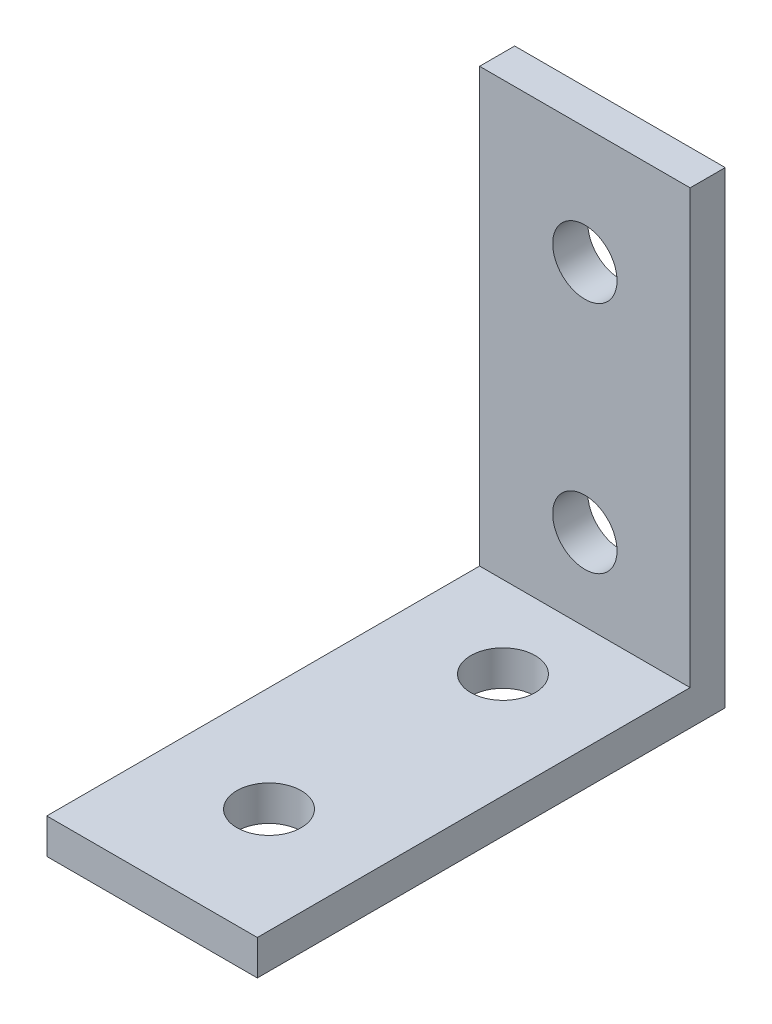
ISO-10303-21;
HEADER;
FILE_DESCRIPTION(('STEP AP214'),'2;1');
FILE_NAME('part.step','',(''),(''),'','','');
FILE_SCHEMA(('AUTOMOTIVE_DESIGN { 1 0 10303 214 1 1 1 1 }'));
ENDSEC;
DATA;
#1=APPLICATION_CONTEXT('core data for automotive mechanical design processes');
#2=APPLICATION_PROTOCOL_DEFINITION('international standard','automotive_design',2000,#1);
#3=PRODUCT_CONTEXT('',#1,'mechanical');
#4=PRODUCT('Part','Part','',(#3));
#5=PRODUCT_RELATED_PRODUCT_CATEGORY('part','',(#4));
#6=PRODUCT_DEFINITION_FORMATION('','',#4);
#7=PRODUCT_DEFINITION_CONTEXT('part definition',#1,'design');
#8=PRODUCT_DEFINITION('design','',#6,#7);
#9=PRODUCT_DEFINITION_SHAPE('','',#8);
#10=(LENGTH_UNIT() NAMED_UNIT(*) SI_UNIT(.MILLI.,.METRE.));
#11=(NAMED_UNIT(*) PLANE_ANGLE_UNIT() SI_UNIT($,.RADIAN.));
#12=(NAMED_UNIT(*) SI_UNIT($,.STERADIAN.) SOLID_ANGLE_UNIT());
#13=UNCERTAINTY_MEASURE_WITH_UNIT(LENGTH_MEASURE(1.E-05),#10,'distance_accuracy_value','');
#14=(GEOMETRIC_REPRESENTATION_CONTEXT(3) GLOBAL_UNCERTAINTY_ASSIGNED_CONTEXT((#13)) GLOBAL_UNIT_ASSIGNED_CONTEXT((#10,
#11,#12)) REPRESENTATION_CONTEXT('',''));
#15=CARTESIAN_POINT('',(0.,0.,0.));
#16=DIRECTION('',(0.,0.,1.));
#17=DIRECTION('',(1.,0.,0.));
#18=AXIS2_PLACEMENT_3D('',#15,#16,#17);
#19=CARTESIAN_POINT('',(0.,3.,0.));
#20=DIRECTION('',(0.,1.,0.));
#21=DIRECTION('',(0.,0.,1.));
#22=AXIS2_PLACEMENT_3D('',#19,#20,#21);
#23=PLANE('',#22);
#24=DIRECTION('',(1.,0.,0.));
#25=VECTOR('',#24,1.);
#26=CARTESIAN_POINT('',(-9.,3.,-17.));
#27=LINE('',#26,#25);
#28=CARTESIAN_POINT('',(-9.,3.,-17.));
#29=VERTEX_POINT('',#28);
#30=CARTESIAN_POINT('',(9.,3.,-17.));
#31=VERTEX_POINT('',#30);
#32=EDGE_CURVE('E51',#29,#31,#27,.T.);
#33=ORIENTED_EDGE('',*,*,#32,.F.);
#34=DIRECTION('',(0.,0.,1.));
#35=VECTOR('',#34,1.);
#36=CARTESIAN_POINT('',(-9.,3.,-20.));
#37=LINE('',#36,#35);
#38=CARTESIAN_POINT('',(-9.,3.,20.));
#39=VERTEX_POINT('',#38);
#40=EDGE_CURVE('E150',#29,#39,#37,.T.);
#41=ORIENTED_EDGE('',*,*,#40,.T.);
#42=DIRECTION('',(1.,0.,0.));
#43=VECTOR('',#42,1.);
#44=CARTESIAN_POINT('',(-9.,3.,20.));
#45=LINE('',#44,#43);
#46=CARTESIAN_POINT('',(9.,3.,20.));
#47=VERTEX_POINT('',#46);
#48=EDGE_CURVE('E57',#39,#47,#45,.T.);
#49=ORIENTED_EDGE('',*,*,#48,.T.);
#50=DIRECTION('',(0.,0.,-1.));
#51=VECTOR('',#50,1.);
#52=CARTESIAN_POINT('',(9.,3.,-20.));
#53=LINE('',#52,#51);
#54=EDGE_CURVE('E86',#47,#31,#53,.T.);
#55=ORIENTED_EDGE('',*,*,#54,.T.);
#56=EDGE_LOOP('',(#33,#41,#49,#55));
#57=FACE_BOUND('',#56,.T.);
#58=CARTESIAN_POINT('',(0.,3.,10.));
#59=DIRECTION('',(0.,1.,0.));
#60=DIRECTION('',(0.,0.,1.));
#61=AXIS2_PLACEMENT_3D('',#58,#59,#60);
#62=CIRCLE('',#61,2.75);
#63=CARTESIAN_POINT('',(0.,3.,12.75));
#64=VERTEX_POINT('',#63);
#65=EDGE_CURVE('E98',#64,#64,#62,.T.);
#66=ORIENTED_EDGE('',*,*,#65,.F.);
#67=EDGE_LOOP('',(#66));
#68=FACE_BOUND('',#67,.T.);
#69=CARTESIAN_POINT('',(0.,3.,-10.));
#70=DIRECTION('',(0.,1.,0.));
#71=DIRECTION('',(0.,0.,1.));
#72=AXIS2_PLACEMENT_3D('',#69,#70,#71);
#73=CIRCLE('',#72,2.75);
#74=CARTESIAN_POINT('',(0.,3.,-7.25));
#75=VERTEX_POINT('',#74);
#76=EDGE_CURVE('E143',#75,#75,#73,.T.);
#77=ORIENTED_EDGE('',*,*,#76,.F.);
#78=EDGE_LOOP('',(#77));
#79=FACE_BOUND('',#78,.T.);
#80=ADVANCED_FACE('F36',(#57,#68,#79),#23,.T.);
#81=CARTESIAN_POINT('',(0.,0.,0.));
#82=DIRECTION('',(0.,1.,0.));
#83=DIRECTION('',(0.,0.,1.));
#84=AXIS2_PLACEMENT_3D('',#81,#82,#83);
#85=PLANE('',#84);
#86=DIRECTION('',(0.,0.,-1.));
#87=VECTOR('',#86,1.);
#88=CARTESIAN_POINT('',(9.,0.,-20.));
#89=LINE('',#88,#87);
#90=CARTESIAN_POINT('',(9.,0.,20.));
#91=VERTEX_POINT('',#90);
#92=CARTESIAN_POINT('',(9.,0.,-20.));
#93=VERTEX_POINT('',#92);
#94=EDGE_CURVE('E92',#91,#93,#89,.T.);
#95=ORIENTED_EDGE('',*,*,#94,.F.);
#96=DIRECTION('',(1.,0.,0.));
#97=VECTOR('',#96,1.);
#98=CARTESIAN_POINT('',(-9.,0.,20.));
#99=LINE('',#98,#97);
#100=CARTESIAN_POINT('',(-9.,0.,20.));
#101=VERTEX_POINT('',#100);
#102=EDGE_CURVE('E76',#101,#91,#99,.T.);
#103=ORIENTED_EDGE('',*,*,#102,.F.);
#104=DIRECTION('',(0.,0.,1.));
#105=VECTOR('',#104,1.);
#106=CARTESIAN_POINT('',(-9.,0.,-20.));
#107=LINE('',#106,#105);
#108=CARTESIAN_POINT('',(-9.,0.,-20.));
#109=VERTEX_POINT('',#108);
#110=EDGE_CURVE('E87',#109,#101,#107,.T.);
#111=ORIENTED_EDGE('',*,*,#110,.F.);
#112=DIRECTION('',(-1.,0.,0.));
#113=VECTOR('',#112,1.);
#114=CARTESIAN_POINT('',(-9.,0.,-20.));
#115=LINE('',#114,#113);
#116=EDGE_CURVE('E97',#93,#109,#115,.T.);
#117=ORIENTED_EDGE('',*,*,#116,.F.);
#118=EDGE_LOOP('',(#95,#103,#111,#117));
#119=FACE_BOUND('',#118,.T.);
#120=CARTESIAN_POINT('',(0.,0.,10.));
#121=DIRECTION('',(0.,1.,0.));
#122=DIRECTION('',(0.,0.,1.));
#123=AXIS2_PLACEMENT_3D('',#120,#121,#122);
#124=CIRCLE('',#123,2.75);
#125=CARTESIAN_POINT('',(0.,0.,12.75));
#126=VERTEX_POINT('',#125);
#127=EDGE_CURVE('E102',#126,#126,#124,.T.);
#128=ORIENTED_EDGE('',*,*,#127,.T.);
#129=EDGE_LOOP('',(#128));
#130=FACE_BOUND('',#129,.T.);
#131=CARTESIAN_POINT('',(0.,0.,-10.));
#132=DIRECTION('',(0.,1.,0.));
#133=DIRECTION('',(0.,0.,1.));
#134=AXIS2_PLACEMENT_3D('',#131,#132,#133);
#135=CIRCLE('',#134,2.75);
#136=CARTESIAN_POINT('',(0.,0.,-7.25));
#137=VERTEX_POINT('',#136);
#138=EDGE_CURVE('E142',#137,#137,#135,.T.);
#139=ORIENTED_EDGE('',*,*,#138,.T.);
#140=EDGE_LOOP('',(#139));
#141=FACE_BOUND('',#140,.T.);
#142=ADVANCED_FACE('F95',(#119,#130,#141),#85,.F.);
#143=CARTESIAN_POINT('',(9.,3.,-20.));
#144=DIRECTION('',(-1.,0.,0.));
#145=DIRECTION('',(0.,0.,1.));
#146=AXIS2_PLACEMENT_3D('',#143,#144,#145);
#147=PLANE('',#146);
#148=ORIENTED_EDGE('',*,*,#94,.T.);
#149=DIRECTION('',(0.,-1.,0.));
#150=VECTOR('',#149,1.);
#151=CARTESIAN_POINT('',(9.,3.,-20.));
#152=LINE('',#151,#150);
#153=CARTESIAN_POINT('',(9.,40.,-20.));
#154=VERTEX_POINT('',#153);
#155=EDGE_CURVE('E11',#154,#93,#152,.T.);
#156=ORIENTED_EDGE('',*,*,#155,.F.);
#157=DIRECTION('',(0.,0.,-1.));
#158=VECTOR('',#157,1.);
#159=CARTESIAN_POINT('',(9.,40.,-20.));
#160=LINE('',#159,#158);
#161=CARTESIAN_POINT('',(9.,40.,-17.));
#162=VERTEX_POINT('',#161);
#163=EDGE_CURVE('E129',#162,#154,#160,.T.);
#164=ORIENTED_EDGE('',*,*,#163,.F.);
#165=DIRECTION('',(0.,-1.,0.));
#166=VECTOR('',#165,1.);
#167=CARTESIAN_POINT('',(9.,40.,-17.));
#168=LINE('',#167,#166);
#169=EDGE_CURVE('E130',#162,#31,#168,.T.);
#170=ORIENTED_EDGE('',*,*,#169,.T.);
#171=ORIENTED_EDGE('',*,*,#54,.F.);
#172=DIRECTION('',(0.,-1.,0.));
#173=VECTOR('',#172,1.);
#174=CARTESIAN_POINT('',(9.,3.,20.));
#175=LINE('',#174,#173);
#176=EDGE_CURVE('E79',#47,#91,#175,.T.);
#177=ORIENTED_EDGE('',*,*,#176,.T.);
#178=EDGE_LOOP('',(#148,#156,#164,#170,#171,#177));
#179=FACE_BOUND('',#178,.T.);
#180=ADVANCED_FACE('F38',(#179),#147,.F.);
#181=CARTESIAN_POINT('',(-9.,3.,-20.));
#182=DIRECTION('',(0.,0.,1.));
#183=DIRECTION('',(1.,0.,0.));
#184=AXIS2_PLACEMENT_3D('',#181,#182,#183);
#185=PLANE('',#184);
#186=CARTESIAN_POINT('',(0.,30.,-20.));
#187=DIRECTION('',(0.,0.,1.));
#188=DIRECTION('',(1.,0.,0.));
#189=AXIS2_PLACEMENT_3D('',#186,#187,#188);
#190=CIRCLE('',#189,2.75);
#191=CARTESIAN_POINT('',(2.75,30.,-20.));
#192=VERTEX_POINT('',#191);
#193=EDGE_CURVE('E138',#192,#192,#190,.T.);
#194=ORIENTED_EDGE('',*,*,#193,.T.);
#195=EDGE_LOOP('',(#194));
#196=FACE_BOUND('',#195,.T.);
#197=CARTESIAN_POINT('',(0.,10.,-20.));
#198=DIRECTION('',(0.,0.,1.));
#199=DIRECTION('',(1.,0.,0.));
#200=AXIS2_PLACEMENT_3D('',#197,#198,#199);
#201=CIRCLE('',#200,2.75);
#202=CARTESIAN_POINT('',(2.75,10.,-20.));
#203=VERTEX_POINT('',#202);
#204=EDGE_CURVE('E163',#203,#203,#201,.T.);
#205=ORIENTED_EDGE('',*,*,#204,.T.);
#206=EDGE_LOOP('',(#205));
#207=FACE_BOUND('',#206,.T.);
#208=ORIENTED_EDGE('',*,*,#116,.T.);
#209=DIRECTION('',(0.,-1.,0.));
#210=VECTOR('',#209,1.);
#211=CARTESIAN_POINT('',(-9.,3.,-20.));
#212=LINE('',#211,#210);
#213=CARTESIAN_POINT('',(-9.,40.,-20.));
#214=VERTEX_POINT('',#213);
#215=EDGE_CURVE('E44',#214,#109,#212,.T.);
#216=ORIENTED_EDGE('',*,*,#215,.F.);
#217=DIRECTION('',(-1.,0.,0.));
#218=VECTOR('',#217,1.);
#219=CARTESIAN_POINT('',(-9.,40.,-20.));
#220=LINE('',#219,#218);
#221=EDGE_CURVE('E121',#154,#214,#220,.T.);
#222=ORIENTED_EDGE('',*,*,#221,.F.);
#223=ORIENTED_EDGE('',*,*,#155,.T.);
#224=EDGE_LOOP('',(#208,#216,#222,#223));
#225=FACE_BOUND('',#224,.T.);
#226=ADVANCED_FACE('F119',(#196,#207,#225),#185,.F.);
#227=CARTESIAN_POINT('',(-9.,3.,-20.));
#228=DIRECTION('',(1.,0.,0.));
#229=DIRECTION('',(0.,0.,-1.));
#230=AXIS2_PLACEMENT_3D('',#227,#228,#229);
#231=PLANE('',#230);
#232=ORIENTED_EDGE('',*,*,#110,.T.);
#233=DIRECTION('',(0.,-1.,0.));
#234=VECTOR('',#233,1.);
#235=CARTESIAN_POINT('',(-9.,3.,20.));
#236=LINE('',#235,#234);
#237=EDGE_CURVE('E82',#39,#101,#236,.T.);
#238=ORIENTED_EDGE('',*,*,#237,.F.);
#239=ORIENTED_EDGE('',*,*,#40,.F.);
#240=DIRECTION('',(0.,-1.,0.));
#241=VECTOR('',#240,1.);
#242=CARTESIAN_POINT('',(-9.,40.,-17.));
#243=LINE('',#242,#241);
#244=CARTESIAN_POINT('',(-9.,40.,-17.));
#245=VERTEX_POINT('',#244);
#246=EDGE_CURVE('E132',#245,#29,#243,.T.);
#247=ORIENTED_EDGE('',*,*,#246,.F.);
#248=DIRECTION('',(0.,0.,1.));
#249=VECTOR('',#248,1.);
#250=CARTESIAN_POINT('',(-9.,40.,-20.));
#251=LINE('',#250,#249);
#252=EDGE_CURVE('E115',#214,#245,#251,.T.);
#253=ORIENTED_EDGE('',*,*,#252,.F.);
#254=ORIENTED_EDGE('',*,*,#215,.T.);
#255=EDGE_LOOP('',(#232,#238,#239,#247,#253,#254));
#256=FACE_BOUND('',#255,.T.);
#257=ADVANCED_FACE('F112',(#256),#231,.F.);
#258=CARTESIAN_POINT('',(-9.,3.,20.));
#259=DIRECTION('',(0.,0.,-1.));
#260=DIRECTION('',(-1.,0.,0.));
#261=AXIS2_PLACEMENT_3D('',#258,#259,#260);
#262=PLANE('',#261);
#263=ORIENTED_EDGE('',*,*,#102,.T.);
#264=ORIENTED_EDGE('',*,*,#176,.F.);
#265=ORIENTED_EDGE('',*,*,#48,.F.);
#266=ORIENTED_EDGE('',*,*,#237,.T.);
#267=EDGE_LOOP('',(#263,#264,#265,#266));
#268=FACE_BOUND('',#267,.T.);
#269=ADVANCED_FACE('F78',(#268),#262,.F.);
#270=CARTESIAN_POINT('',(0.,3.,10.));
#271=DIRECTION('',(0.,-1.,0.));
#272=DIRECTION('',(0.,0.,-1.));
#273=AXIS2_PLACEMENT_3D('',#270,#271,#272);
#274=CYLINDRICAL_SURFACE('',#273,2.75);
#275=ORIENTED_EDGE('',*,*,#65,.T.);
#276=EDGE_LOOP('',(#275));
#277=FACE_BOUND('',#276,.T.);
#278=ORIENTED_EDGE('',*,*,#127,.F.);
#279=EDGE_LOOP('',(#278));
#280=FACE_BOUND('',#279,.T.);
#281=ADVANCED_FACE('F202',(#277,#280),#274,.F.);
#282=CARTESIAN_POINT('',(0.,3.,-10.));
#283=DIRECTION('',(0.,-1.,0.));
#284=DIRECTION('',(0.,0.,-1.));
#285=AXIS2_PLACEMENT_3D('',#282,#283,#284);
#286=CYLINDRICAL_SURFACE('',#285,2.75);
#287=ORIENTED_EDGE('',*,*,#76,.T.);
#288=EDGE_LOOP('',(#287));
#289=FACE_BOUND('',#288,.T.);
#290=ORIENTED_EDGE('',*,*,#138,.F.);
#291=EDGE_LOOP('',(#290));
#292=FACE_BOUND('',#291,.T.);
#293=ADVANCED_FACE('F178',(#289,#292),#286,.F.);
#294=CARTESIAN_POINT('',(-9.,40.,-17.));
#295=DIRECTION('',(0.,0.,-1.));
#296=DIRECTION('',(-1.,0.,0.));
#297=AXIS2_PLACEMENT_3D('',#294,#295,#296);
#298=PLANE('',#297);
#299=CARTESIAN_POINT('',(0.,30.,-17.));
#300=DIRECTION('',(0.,0.,1.));
#301=DIRECTION('',(1.,0.,0.));
#302=AXIS2_PLACEMENT_3D('',#299,#300,#301);
#303=CIRCLE('',#302,2.75);
#304=CARTESIAN_POINT('',(2.75,30.,-17.));
#305=VERTEX_POINT('',#304);
#306=EDGE_CURVE('E166',#305,#305,#303,.T.);
#307=ORIENTED_EDGE('',*,*,#306,.F.);
#308=EDGE_LOOP('',(#307));
#309=FACE_BOUND('',#308,.T.);
#310=CARTESIAN_POINT('',(0.,10.,-17.));
#311=DIRECTION('',(0.,0.,1.));
#312=DIRECTION('',(1.,0.,0.));
#313=AXIS2_PLACEMENT_3D('',#310,#311,#312);
#314=CIRCLE('',#313,2.75);
#315=CARTESIAN_POINT('',(2.75,10.,-17.));
#316=VERTEX_POINT('',#315);
#317=EDGE_CURVE('E167',#316,#316,#314,.T.);
#318=ORIENTED_EDGE('',*,*,#317,.F.);
#319=EDGE_LOOP('',(#318));
#320=FACE_BOUND('',#319,.T.);
#321=ORIENTED_EDGE('',*,*,#32,.T.);
#322=ORIENTED_EDGE('',*,*,#169,.F.);
#323=DIRECTION('',(1.,0.,0.));
#324=VECTOR('',#323,1.);
#325=CARTESIAN_POINT('',(-9.,40.,-17.));
#326=LINE('',#325,#324);
#327=EDGE_CURVE('E134',#245,#162,#326,.T.);
#328=ORIENTED_EDGE('',*,*,#327,.F.);
#329=ORIENTED_EDGE('',*,*,#246,.T.);
#330=EDGE_LOOP('',(#321,#322,#328,#329));
#331=FACE_BOUND('',#330,.T.);
#332=ADVANCED_FACE('F154',(#309,#320,#331),#298,.F.);
#333=CARTESIAN_POINT('',(0.,40.,0.));
#334=DIRECTION('',(0.,1.,0.));
#335=DIRECTION('',(0.,0.,1.));
#336=AXIS2_PLACEMENT_3D('',#333,#334,#335);
#337=PLANE('',#336);
#338=ORIENTED_EDGE('',*,*,#252,.T.);
#339=ORIENTED_EDGE('',*,*,#327,.T.);
#340=ORIENTED_EDGE('',*,*,#163,.T.);
#341=ORIENTED_EDGE('',*,*,#221,.T.);
#342=EDGE_LOOP('',(#338,#339,#340,#341));
#343=FACE_BOUND('',#342,.T.);
#344=ADVANCED_FACE('F125',(#343),#337,.T.);
#345=CARTESIAN_POINT('',(0.,10.,-54.));
#346=DIRECTION('',(0.,0.,1.));
#347=DIRECTION('',(1.,0.,0.));
#348=AXIS2_PLACEMENT_3D('',#345,#346,#347);
#349=CYLINDRICAL_SURFACE('',#348,2.75);
#350=ORIENTED_EDGE('',*,*,#317,.T.);
#351=EDGE_LOOP('',(#350));
#352=FACE_BOUND('',#351,.T.);
#353=ORIENTED_EDGE('',*,*,#204,.F.);
#354=EDGE_LOOP('',(#353));
#355=FACE_BOUND('',#354,.T.);
#356=ADVANCED_FACE('F182',(#352,#355),#349,.F.);
#357=CARTESIAN_POINT('',(0.,30.,-54.));
#358=DIRECTION('',(0.,0.,1.));
#359=DIRECTION('',(1.,0.,0.));
#360=AXIS2_PLACEMENT_3D('',#357,#358,#359);
#361=CYLINDRICAL_SURFACE('',#360,2.75);
#362=ORIENTED_EDGE('',*,*,#306,.T.);
#363=EDGE_LOOP('',(#362));
#364=FACE_BOUND('',#363,.T.);
#365=ORIENTED_EDGE('',*,*,#193,.F.);
#366=EDGE_LOOP('',(#365));
#367=FACE_BOUND('',#366,.T.);
#368=ADVANCED_FACE('F173',(#364,#367),#361,.F.);
#369=CLOSED_SHELL('',(#80,#142,#180,#226,#257,#269,#281,#293,#332,#344,#356,#368));
#370=MANIFOLD_SOLID_BREP('B2',#369);
#371=ADVANCED_BREP_SHAPE_REPRESENTATION('',(#18,#370),#14);
#372=SHAPE_DEFINITION_REPRESENTATION(#9,#371);
ENDSEC;
END-ISO-10303-21;
